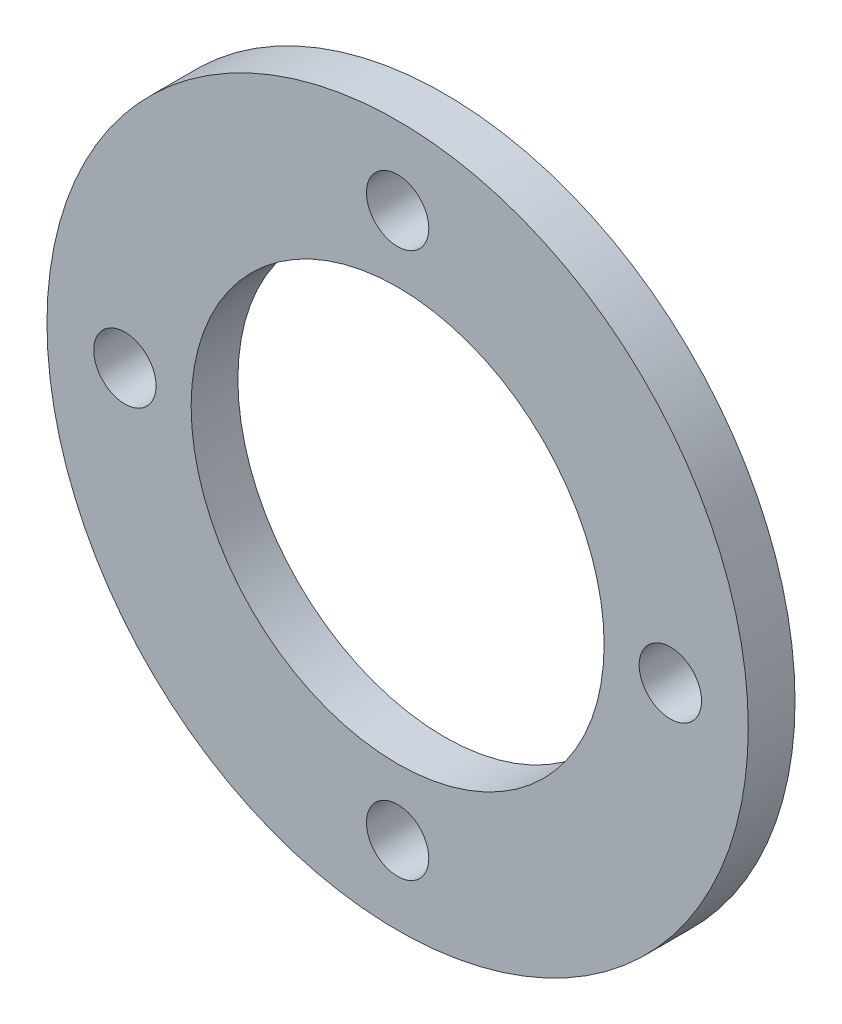
ISO-10303-21;
HEADER;
FILE_DESCRIPTION(('STEP AP214'),'2;1');
FILE_NAME('part.step','',(''),(''),'','','');
FILE_SCHEMA(('AUTOMOTIVE_DESIGN { 1 0 10303 214 1 1 1 1 }'));
ENDSEC;
DATA;
#1=APPLICATION_CONTEXT('core data for automotive mechanical design processes');
#2=APPLICATION_PROTOCOL_DEFINITION('international standard','automotive_design',2000,#1);
#3=PRODUCT_CONTEXT('',#1,'mechanical');
#4=PRODUCT('Part','Part','',(#3));
#5=PRODUCT_RELATED_PRODUCT_CATEGORY('part','',(#4));
#6=PRODUCT_DEFINITION_FORMATION('','',#4);
#7=PRODUCT_DEFINITION_CONTEXT('part definition',#1,'design');
#8=PRODUCT_DEFINITION('design','',#6,#7);
#9=PRODUCT_DEFINITION_SHAPE('','',#8);
#10=(LENGTH_UNIT() NAMED_UNIT(*) SI_UNIT(.MILLI.,.METRE.));
#11=(NAMED_UNIT(*) PLANE_ANGLE_UNIT() SI_UNIT($,.RADIAN.));
#12=(NAMED_UNIT(*) SI_UNIT($,.STERADIAN.) SOLID_ANGLE_UNIT());
#13=UNCERTAINTY_MEASURE_WITH_UNIT(LENGTH_MEASURE(1.E-05),#10,'distance_accuracy_value','');
#14=(GEOMETRIC_REPRESENTATION_CONTEXT(3) GLOBAL_UNCERTAINTY_ASSIGNED_CONTEXT((#13)) GLOBAL_UNIT_ASSIGNED_CONTEXT((#10,
#11,#12)) REPRESENTATION_CONTEXT('',''));
#15=CARTESIAN_POINT('',(0.,0.,0.));
#16=DIRECTION('',(0.,0.,1.));
#17=DIRECTION('',(1.,0.,0.));
#18=AXIS2_PLACEMENT_3D('',#15,#16,#17);
#19=CARTESIAN_POINT('',(0.,0.,3.));
#20=DIRECTION('',(0.,0.,1.));
#21=DIRECTION('',(1.,0.,0.));
#22=AXIS2_PLACEMENT_3D('',#19,#20,#21);
#23=PLANE('',#22);
#24=CARTESIAN_POINT('',(0.,-17.5,3.));
#25=DIRECTION('',(0.,0.,1.));
#26=DIRECTION('',(1.,0.,0.));
#27=AXIS2_PLACEMENT_3D('',#24,#25,#26);
#28=CIRCLE('',#27,2.);
#29=CARTESIAN_POINT('',(2.,-17.5,3.));
#30=VERTEX_POINT('',#29);
#31=EDGE_CURVE('E72',#30,#30,#28,.T.);
#32=ORIENTED_EDGE('',*,*,#31,.F.);
#33=EDGE_LOOP('',(#32));
#34=FACE_BOUND('',#33,.T.);
#35=CARTESIAN_POINT('',(0.,17.5,3.));
#36=DIRECTION('',(0.,0.,1.));
#37=DIRECTION('',(1.,0.,0.));
#38=AXIS2_PLACEMENT_3D('',#35,#36,#37);
#39=CIRCLE('',#38,2.);
#40=CARTESIAN_POINT('',(2.,17.5,3.));
#41=VERTEX_POINT('',#40);
#42=EDGE_CURVE('E56',#41,#41,#39,.T.);
#43=ORIENTED_EDGE('',*,*,#42,.F.);
#44=EDGE_LOOP('',(#43));
#45=FACE_BOUND('',#44,.T.);
#46=CARTESIAN_POINT('',(0.,0.,3.));
#47=DIRECTION('',(0.,0.,1.));
#48=DIRECTION('',(1.,0.,0.));
#49=AXIS2_PLACEMENT_3D('',#46,#47,#48);
#50=CIRCLE('',#49,22.5);
#51=CARTESIAN_POINT('',(22.5,0.,3.));
#52=VERTEX_POINT('',#51);
#53=EDGE_CURVE('E10',#52,#52,#50,.T.);
#54=ORIENTED_EDGE('',*,*,#53,.T.);
#55=EDGE_LOOP('',(#54));
#56=FACE_BOUND('',#55,.T.);
#57=CARTESIAN_POINT('',(0.,0.,3.));
#58=DIRECTION('',(0.,0.,1.));
#59=DIRECTION('',(1.,0.,0.));
#60=AXIS2_PLACEMENT_3D('',#57,#58,#59);
#61=CIRCLE('',#60,13.25);
#62=CARTESIAN_POINT('',(13.25,0.,3.));
#63=VERTEX_POINT('',#62);
#64=EDGE_CURVE('E50',#63,#63,#61,.T.);
#65=ORIENTED_EDGE('',*,*,#64,.F.);
#66=EDGE_LOOP('',(#65));
#67=FACE_BOUND('',#66,.T.);
#68=CARTESIAN_POINT('',(-17.5,0.,3.));
#69=DIRECTION('',(0.,0.,1.));
#70=DIRECTION('',(1.,0.,0.));
#71=AXIS2_PLACEMENT_3D('',#68,#69,#70);
#72=CIRCLE('',#71,2.);
#73=CARTESIAN_POINT('',(-15.5,0.,3.));
#74=VERTEX_POINT('',#73);
#75=EDGE_CURVE('E64',#74,#74,#72,.T.);
#76=ORIENTED_EDGE('',*,*,#75,.F.);
#77=EDGE_LOOP('',(#76));
#78=FACE_BOUND('',#77,.T.);
#79=CARTESIAN_POINT('',(17.5,0.,3.));
#80=DIRECTION('',(0.,0.,1.));
#81=DIRECTION('',(1.,0.,0.));
#82=AXIS2_PLACEMENT_3D('',#79,#80,#81);
#83=CIRCLE('',#82,2.);
#84=CARTESIAN_POINT('',(19.5,0.,3.));
#85=VERTEX_POINT('',#84);
#86=EDGE_CURVE('E80',#85,#85,#83,.T.);
#87=ORIENTED_EDGE('',*,*,#86,.F.);
#88=EDGE_LOOP('',(#87));
#89=FACE_BOUND('',#88,.T.);
#90=ADVANCED_FACE('F37',(#34,#45,#56,#67,#78,#89),#23,.T.);
#91=CARTESIAN_POINT('',(0.,0.,0.));
#92=DIRECTION('',(0.,0.,1.));
#93=DIRECTION('',(1.,0.,0.));
#94=AXIS2_PLACEMENT_3D('',#91,#92,#93);
#95=PLANE('',#94);
#96=CARTESIAN_POINT('',(0.,0.,0.));
#97=DIRECTION('',(0.,0.,1.));
#98=DIRECTION('',(1.,0.,0.));
#99=AXIS2_PLACEMENT_3D('',#96,#97,#98);
#100=CIRCLE('',#99,22.5);
#101=CARTESIAN_POINT('',(22.5,0.,0.));
#102=VERTEX_POINT('',#101);
#103=EDGE_CURVE('E41',#102,#102,#100,.T.);
#104=ORIENTED_EDGE('',*,*,#103,.F.);
#105=EDGE_LOOP('',(#104));
#106=FACE_BOUND('',#105,.T.);
#107=CARTESIAN_POINT('',(0.,0.,0.));
#108=DIRECTION('',(0.,0.,1.));
#109=DIRECTION('',(1.,0.,0.));
#110=AXIS2_PLACEMENT_3D('',#107,#108,#109);
#111=CIRCLE('',#110,13.25);
#112=CARTESIAN_POINT('',(13.25,0.,0.));
#113=VERTEX_POINT('',#112);
#114=EDGE_CURVE('E52',#113,#113,#111,.T.);
#115=ORIENTED_EDGE('',*,*,#114,.T.);
#116=EDGE_LOOP('',(#115));
#117=FACE_BOUND('',#116,.T.);
#118=CARTESIAN_POINT('',(0.,17.5,0.));
#119=DIRECTION('',(0.,0.,1.));
#120=DIRECTION('',(1.,0.,0.));
#121=AXIS2_PLACEMENT_3D('',#118,#119,#120);
#122=CIRCLE('',#121,2.);
#123=CARTESIAN_POINT('',(2.,17.5,0.));
#124=VERTEX_POINT('',#123);
#125=EDGE_CURVE('E60',#124,#124,#122,.T.);
#126=ORIENTED_EDGE('',*,*,#125,.T.);
#127=EDGE_LOOP('',(#126));
#128=FACE_BOUND('',#127,.T.);
#129=CARTESIAN_POINT('',(-17.5,0.,0.));
#130=DIRECTION('',(0.,0.,1.));
#131=DIRECTION('',(1.,0.,0.));
#132=AXIS2_PLACEMENT_3D('',#129,#130,#131);
#133=CIRCLE('',#132,2.);
#134=CARTESIAN_POINT('',(-15.5,0.,0.));
#135=VERTEX_POINT('',#134);
#136=EDGE_CURVE('E68',#135,#135,#133,.T.);
#137=ORIENTED_EDGE('',*,*,#136,.T.);
#138=EDGE_LOOP('',(#137));
#139=FACE_BOUND('',#138,.T.);
#140=CARTESIAN_POINT('',(0.,-17.5,0.));
#141=DIRECTION('',(0.,0.,1.));
#142=DIRECTION('',(1.,0.,0.));
#143=AXIS2_PLACEMENT_3D('',#140,#141,#142);
#144=CIRCLE('',#143,2.);
#145=CARTESIAN_POINT('',(2.,-17.5,0.));
#146=VERTEX_POINT('',#145);
#147=EDGE_CURVE('E76',#146,#146,#144,.T.);
#148=ORIENTED_EDGE('',*,*,#147,.T.);
#149=EDGE_LOOP('',(#148));
#150=FACE_BOUND('',#149,.T.);
#151=CARTESIAN_POINT('',(17.5,0.,0.));
#152=DIRECTION('',(0.,0.,1.));
#153=DIRECTION('',(1.,0.,0.));
#154=AXIS2_PLACEMENT_3D('',#151,#152,#153);
#155=CIRCLE('',#154,2.);
#156=CARTESIAN_POINT('',(19.5,0.,0.));
#157=VERTEX_POINT('',#156);
#158=EDGE_CURVE('E84',#157,#157,#155,.T.);
#159=ORIENTED_EDGE('',*,*,#158,.T.);
#160=EDGE_LOOP('',(#159));
#161=FACE_BOUND('',#160,.T.);
#162=ADVANCED_FACE('F96',(#106,#117,#128,#139,#150,#161),#95,.F.);
#163=CARTESIAN_POINT('',(0.,0.,3.));
#164=DIRECTION('',(0.,0.,-1.));
#165=DIRECTION('',(-1.,0.,0.));
#166=AXIS2_PLACEMENT_3D('',#163,#164,#165);
#167=CYLINDRICAL_SURFACE('',#166,22.5);
#168=ORIENTED_EDGE('',*,*,#53,.F.);
#169=EDGE_LOOP('',(#168));
#170=FACE_BOUND('',#169,.T.);
#171=ORIENTED_EDGE('',*,*,#103,.T.);
#172=EDGE_LOOP('',(#171));
#173=FACE_BOUND('',#172,.T.);
#174=ADVANCED_FACE('F39',(#170,#173),#167,.T.);
#175=CARTESIAN_POINT('',(0.,0.,3.));
#176=DIRECTION('',(0.,0.,-1.));
#177=DIRECTION('',(-1.,0.,0.));
#178=AXIS2_PLACEMENT_3D('',#175,#176,#177);
#179=CYLINDRICAL_SURFACE('',#178,13.25);
#180=ORIENTED_EDGE('',*,*,#64,.T.);
#181=EDGE_LOOP('',(#180));
#182=FACE_BOUND('',#181,.T.);
#183=ORIENTED_EDGE('',*,*,#114,.F.);
#184=EDGE_LOOP('',(#183));
#185=FACE_BOUND('',#184,.T.);
#186=ADVANCED_FACE('F106',(#182,#185),#179,.F.);
#187=CARTESIAN_POINT('',(0.,17.5,3.));
#188=DIRECTION('',(0.,0.,-1.));
#189=DIRECTION('',(-1.,0.,0.));
#190=AXIS2_PLACEMENT_3D('',#187,#188,#189);
#191=CYLINDRICAL_SURFACE('',#190,2.);
#192=ORIENTED_EDGE('',*,*,#42,.T.);
#193=EDGE_LOOP('',(#192));
#194=FACE_BOUND('',#193,.T.);
#195=ORIENTED_EDGE('',*,*,#125,.F.);
#196=EDGE_LOOP('',(#195));
#197=FACE_BOUND('',#196,.T.);
#198=ADVANCED_FACE('F109',(#194,#197),#191,.F.);
#199=CARTESIAN_POINT('',(-17.5,0.,3.));
#200=DIRECTION('',(0.,0.,-1.));
#201=DIRECTION('',(-1.,0.,0.));
#202=AXIS2_PLACEMENT_3D('',#199,#200,#201);
#203=CYLINDRICAL_SURFACE('',#202,2.);
#204=ORIENTED_EDGE('',*,*,#75,.T.);
#205=EDGE_LOOP('',(#204));
#206=FACE_BOUND('',#205,.T.);
#207=ORIENTED_EDGE('',*,*,#136,.F.);
#208=EDGE_LOOP('',(#207));
#209=FACE_BOUND('',#208,.T.);
#210=ADVANCED_FACE('F113',(#206,#209),#203,.F.);
#211=CARTESIAN_POINT('',(0.,-17.5,3.));
#212=DIRECTION('',(0.,0.,-1.));
#213=DIRECTION('',(-1.,0.,0.));
#214=AXIS2_PLACEMENT_3D('',#211,#212,#213);
#215=CYLINDRICAL_SURFACE('',#214,2.);
#216=ORIENTED_EDGE('',*,*,#31,.T.);
#217=EDGE_LOOP('',(#216));
#218=FACE_BOUND('',#217,.T.);
#219=ORIENTED_EDGE('',*,*,#147,.F.);
#220=EDGE_LOOP('',(#219));
#221=FACE_BOUND('',#220,.T.);
#222=ADVANCED_FACE('F117',(#218,#221),#215,.F.);
#223=CARTESIAN_POINT('',(17.5,0.,3.));
#224=DIRECTION('',(0.,0.,-1.));
#225=DIRECTION('',(-1.,0.,0.));
#226=AXIS2_PLACEMENT_3D('',#223,#224,#225);
#227=CYLINDRICAL_SURFACE('',#226,2.);
#228=ORIENTED_EDGE('',*,*,#86,.T.);
#229=EDGE_LOOP('',(#228));
#230=FACE_BOUND('',#229,.T.);
#231=ORIENTED_EDGE('',*,*,#158,.F.);
#232=EDGE_LOOP('',(#231));
#233=FACE_BOUND('',#232,.T.);
#234=ADVANCED_FACE('F92',(#230,#233),#227,.F.);
#235=CLOSED_SHELL('',(#90,#162,#174,#186,#198,#210,#222,#234));
#236=MANIFOLD_SOLID_BREP('B2',#235);
#237=ADVANCED_BREP_SHAPE_REPRESENTATION('',(#18,#236),#14);
#238=SHAPE_DEFINITION_REPRESENTATION(#9,#237);
ENDSEC;
END-ISO-10303-21;
